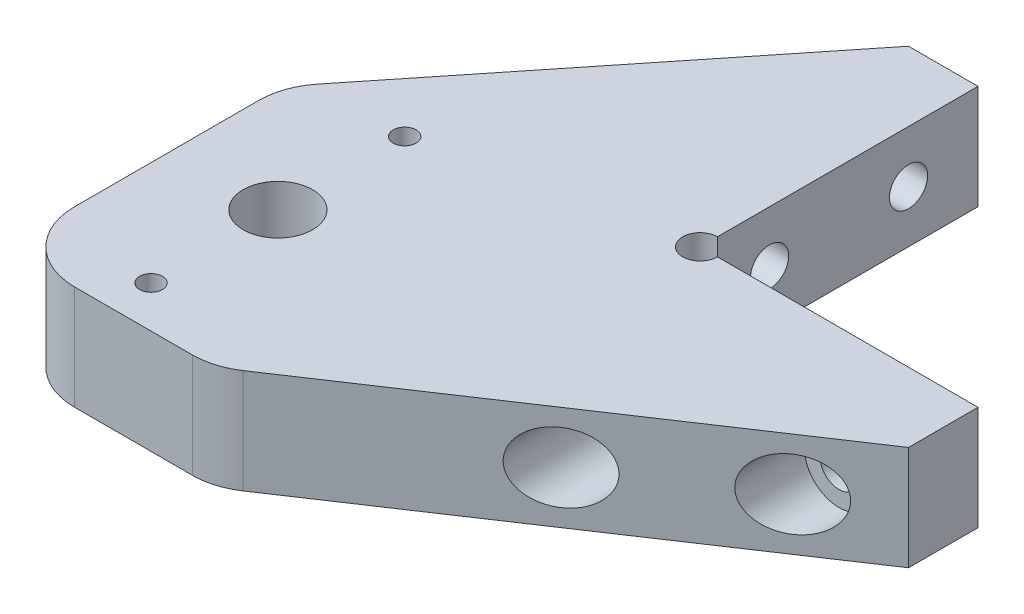
ISO-10303-21;
HEADER;
FILE_DESCRIPTION(('STEP AP214'),'2;1');
FILE_NAME('part.step','',(''),(''),'','','');
FILE_SCHEMA(('AUTOMOTIVE_DESIGN { 1 0 10303 214 1 1 1 1 }'));
ENDSEC;
DATA;
#1=APPLICATION_CONTEXT('core data for automotive mechanical design processes');
#2=APPLICATION_PROTOCOL_DEFINITION('international standard','automotive_design',2000,#1);
#3=PRODUCT_CONTEXT('',#1,'mechanical');
#4=PRODUCT('Part','Part','',(#3));
#5=PRODUCT_RELATED_PRODUCT_CATEGORY('part','',(#4));
#6=PRODUCT_DEFINITION_FORMATION('','',#4);
#7=PRODUCT_DEFINITION_CONTEXT('part definition',#1,'design');
#8=PRODUCT_DEFINITION('design','',#6,#7);
#9=PRODUCT_DEFINITION_SHAPE('','',#8);
#10=(LENGTH_UNIT() NAMED_UNIT(*) SI_UNIT(.MILLI.,.METRE.));
#11=(NAMED_UNIT(*) PLANE_ANGLE_UNIT() SI_UNIT($,.RADIAN.));
#12=(NAMED_UNIT(*) SI_UNIT($,.STERADIAN.) SOLID_ANGLE_UNIT());
#13=UNCERTAINTY_MEASURE_WITH_UNIT(LENGTH_MEASURE(1.E-05),#10,'distance_accuracy_value','');
#14=(GEOMETRIC_REPRESENTATION_CONTEXT(3) GLOBAL_UNCERTAINTY_ASSIGNED_CONTEXT((#13)) GLOBAL_UNIT_ASSIGNED_CONTEXT((#10,
#11,#12)) REPRESENTATION_CONTEXT('',''));
#15=CARTESIAN_POINT('',(0.,0.,0.));
#16=DIRECTION('',(0.,0.,1.));
#17=DIRECTION('',(1.,0.,0.));
#18=AXIS2_PLACEMENT_3D('',#15,#16,#17);
#19=CARTESIAN_POINT('',(0.,7.5,0.));
#20=DIRECTION('',(0.,-1.,0.));
#21=DIRECTION('',(0.,0.,-1.));
#22=AXIS2_PLACEMENT_3D('',#19,#20,#21);
#23=PLANE('',#22);
#24=CARTESIAN_POINT('',(-55.,7.5,64.));
#25=DIRECTION('',(0.,1.,0.));
#26=DIRECTION('',(0.,0.,1.));
#27=AXIS2_PLACEMENT_3D('',#24,#25,#26);
#28=CIRCLE('',#27,1.64999999999998);
#29=CARTESIAN_POINT('',(-55.,7.5,65.65));
#30=VERTEX_POINT('',#29);
#31=EDGE_CURVE('E261',#30,#30,#28,.T.);
#32=ORIENTED_EDGE('',*,*,#31,.F.);
#33=EDGE_LOOP('',(#32));
#34=FACE_BOUND('',#33,.T.);
#35=CARTESIAN_POINT('',(-55.,7.5,27.5));
#36=DIRECTION('',(0.,1.,0.));
#37=DIRECTION('',(0.,0.,1.));
#38=AXIS2_PLACEMENT_3D('',#35,#36,#37);
#39=CIRCLE('',#38,1.64999999999999);
#40=CARTESIAN_POINT('',(-55.,7.5,29.15));
#41=VERTEX_POINT('',#40);
#42=EDGE_CURVE('E253',#41,#41,#39,.T.);
#43=ORIENTED_EDGE('',*,*,#42,.F.);
#44=EDGE_LOOP('',(#43));
#45=FACE_BOUND('',#44,.T.);
#46=CARTESIAN_POINT('',(-55.,7.5,45.75));
#47=DIRECTION('',(0.,1.,0.));
#48=DIRECTION('',(0.,0.,1.));
#49=AXIS2_PLACEMENT_3D('',#46,#47,#48);
#50=CIRCLE('',#49,5.);
#51=CARTESIAN_POINT('',(-55.,7.5,50.75));
#52=VERTEX_POINT('',#51);
#53=EDGE_CURVE('E208',#52,#52,#50,.T.);
#54=ORIENTED_EDGE('',*,*,#53,.F.);
#55=EDGE_LOOP('',(#54));
#56=FACE_BOUND('',#55,.T.);
#57=CARTESIAN_POINT('',(-20.,7.5,20.));
#58=DIRECTION('',(0.,1.,0.));
#59=DIRECTION('',(0.,0.,1.));
#60=AXIS2_PLACEMENT_3D('',#57,#58,#59);
#61=CIRCLE('',#60,2.5);
#62=CARTESIAN_POINT('',(-20.,7.5,17.5));
#63=VERTEX_POINT('',#62);
#64=CARTESIAN_POINT('',(-17.5,7.5,20.));
#65=VERTEX_POINT('',#64);
#66=EDGE_CURVE('E148',#63,#65,#61,.T.);
#67=ORIENTED_EDGE('',*,*,#66,.F.);
#68=DIRECTION('',(0.,0.,-1.));
#69=VECTOR('',#68,1.);
#70=CARTESIAN_POINT('',(-20.,7.5,-20.));
#71=LINE('',#70,#69);
#72=CARTESIAN_POINT('',(-20.,7.5,-20.));
#73=VERTEX_POINT('',#72);
#74=EDGE_CURVE('E147',#63,#73,#71,.T.);
#75=ORIENTED_EDGE('',*,*,#74,.T.);
#76=DIRECTION('',(-1.,0.,0.));
#77=VECTOR('',#76,1.);
#78=CARTESIAN_POINT('',(-30.,7.5,-20.));
#79=LINE('',#78,#77);
#80=CARTESIAN_POINT('',(-30.,7.5,-20.));
#81=VERTEX_POINT('',#80);
#82=EDGE_CURVE('E155',#73,#81,#79,.T.);
#83=ORIENTED_EDGE('',*,*,#82,.T.);
#84=DIRECTION('',(-0.624695047554424,0.,0.78086880944303));
#85=VECTOR('',#84,1.);
#86=CARTESIAN_POINT('',(-30.,7.5,-20.));
#87=LINE('',#86,#85);
#88=CARTESIAN_POINT('',(-67.8086880944303,7.5,27.2608601180379));
#89=VERTEX_POINT('',#88);
#90=EDGE_CURVE('E159',#81,#89,#87,.T.);
#91=ORIENTED_EDGE('',*,*,#90,.T.);
#92=CARTESIAN_POINT('',(-60.,7.5,33.5078105935821));
#93=DIRECTION('',(0.,-1.,0.));
#94=DIRECTION('',(0.,0.,-1.));
#95=AXIS2_PLACEMENT_3D('',#92,#93,#94);
#96=CIRCLE('',#95,10.);
#97=CARTESIAN_POINT('',(-70.,7.5,33.5078105935821));
#98=VERTEX_POINT('',#97);
#99=EDGE_CURVE('E190',#89,#98,#96,.F.);
#100=ORIENTED_EDGE('',*,*,#99,.T.);
#101=DIRECTION('',(0.,0.,1.));
#102=VECTOR('',#101,1.);
#103=CARTESIAN_POINT('',(-70.,7.5,30.));
#104=LINE('',#103,#102);
#105=CARTESIAN_POINT('',(-70.,7.5,60.));
#106=VERTEX_POINT('',#105);
#107=EDGE_CURVE('E269',#98,#106,#104,.T.);
#108=ORIENTED_EDGE('',*,*,#107,.T.);
#109=CARTESIAN_POINT('',(-60.,7.5,60.));
#110=DIRECTION('',(0.,-1.,0.));
#111=DIRECTION('',(0.,0.,-1.));
#112=AXIS2_PLACEMENT_3D('',#109,#110,#111);
#113=CIRCLE('',#112,10.);
#114=CARTESIAN_POINT('',(-60.,7.5,70.));
#115=VERTEX_POINT('',#114);
#116=EDGE_CURVE('E192',#106,#115,#113,.F.);
#117=ORIENTED_EDGE('',*,*,#116,.T.);
#118=DIRECTION('',(1.,0.,0.));
#119=VECTOR('',#118,1.);
#120=CARTESIAN_POINT('',(-70.,7.5,70.));
#121=LINE('',#120,#119);
#122=CARTESIAN_POINT('',(-43.02775637732,7.5,70.));
#123=VERTEX_POINT('',#122);
#124=EDGE_CURVE('E271',#115,#123,#121,.T.);
#125=ORIENTED_EDGE('',*,*,#124,.T.);
#126=CARTESIAN_POINT('',(-43.02775637732,7.5,60.));
#127=DIRECTION('',(0.,-1.,0.));
#128=DIRECTION('',(0.,0.,-1.));
#129=AXIS2_PLACEMENT_3D('',#126,#127,#128);
#130=CIRCLE('',#129,10.);
#131=CARTESIAN_POINT('',(-37.4807544150677,7.5,68.3205029433784));
#132=VERTEX_POINT('',#131);
#133=EDGE_CURVE('E194',#123,#132,#130,.F.);
#134=ORIENTED_EDGE('',*,*,#133,.T.);
#135=DIRECTION('',(0.832050294337844,0.,-0.554700196225229));
#136=VECTOR('',#135,1.);
#137=CARTESIAN_POINT('',(-40.,7.5,70.));
#138=LINE('',#137,#136);
#139=CARTESIAN_POINT('',(20.,7.5,30.));
#140=VERTEX_POINT('',#139);
#141=EDGE_CURVE('E274',#132,#140,#138,.T.);
#142=ORIENTED_EDGE('',*,*,#141,.T.);
#143=DIRECTION('',(0.,0.,-1.));
#144=VECTOR('',#143,1.);
#145=CARTESIAN_POINT('',(20.,7.5,20.));
#146=LINE('',#145,#144);
#147=CARTESIAN_POINT('',(20.,7.5,20.));
#148=VERTEX_POINT('',#147);
#149=EDGE_CURVE('E276',#140,#148,#146,.T.);
#150=ORIENTED_EDGE('',*,*,#149,.T.);
#151=DIRECTION('',(-1.,0.,0.));
#152=VECTOR('',#151,1.);
#153=CARTESIAN_POINT('',(-20.,7.5,20.));
#154=LINE('',#153,#152);
#155=EDGE_CURVE('E278',#148,#65,#154,.T.);
#156=ORIENTED_EDGE('',*,*,#155,.T.);
#157=EDGE_LOOP('',(#67,#75,#83,#91,#100,#108,#117,#125,#134,#142,#150,#156));
#158=FACE_BOUND('',#157,.T.);
#159=ADVANCED_FACE('F46',(#34,#45,#56,#158),#23,.F.);
#160=CARTESIAN_POINT('',(-30.,7.5,-20.));
#161=DIRECTION('',(0.,0.,1.));
#162=DIRECTION('',(1.,0.,0.));
#163=AXIS2_PLACEMENT_3D('',#160,#161,#162);
#164=PLANE('',#163);
#165=DIRECTION('',(-1.,0.,0.));
#166=VECTOR('',#165,1.);
#167=CARTESIAN_POINT('',(-30.,-7.5,-20.));
#168=LINE('',#167,#166);
#169=CARTESIAN_POINT('',(-20.,-7.5,-20.));
#170=VERTEX_POINT('',#169);
#171=CARTESIAN_POINT('',(-30.,-7.5,-20.));
#172=VERTEX_POINT('',#171);
#173=EDGE_CURVE('E154',#170,#172,#168,.T.);
#174=ORIENTED_EDGE('',*,*,#173,.T.);
#175=DIRECTION('',(0.,-1.,0.));
#176=VECTOR('',#175,1.);
#177=CARTESIAN_POINT('',(-30.,7.5,-20.));
#178=LINE('',#177,#176);
#179=EDGE_CURVE('E173',#81,#172,#178,.T.);
#180=ORIENTED_EDGE('',*,*,#179,.F.);
#181=ORIENTED_EDGE('',*,*,#82,.F.);
#182=DIRECTION('',(0.,-1.,0.));
#183=VECTOR('',#182,1.);
#184=CARTESIAN_POINT('',(-20.,7.5,-20.));
#185=LINE('',#184,#183);
#186=EDGE_CURVE('E165',#73,#170,#185,.T.);
#187=ORIENTED_EDGE('',*,*,#186,.T.);
#188=EDGE_LOOP('',(#174,#180,#181,#187));
#189=FACE_BOUND('',#188,.T.);
#190=ADVANCED_FACE('F331',(#189),#164,.F.);
#191=CARTESIAN_POINT('',(-30.,7.5,-20.));
#192=DIRECTION('',(0.78086880944303,0.,0.624695047554424));
#193=DIRECTION('',(0.624695047554424,0.,-0.78086880944303));
#194=AXIS2_PLACEMENT_3D('',#191,#192,#193);
#195=PLANE('',#194);
#196=CARTESIAN_POINT('',(-54.,0.,10.));
#197=DIRECTION('',(0.78086880944303,0.,0.624695047554424));
#198=DIRECTION('',(-0.624695047554424,0.,0.78086880944303));
#199=AXIS2_PLACEMENT_3D('',#196,#197,#198);
#200=ELLIPSE('',#199,6.40312423743284,4.99999999999999);
#201=CARTESIAN_POINT('',(-58.,0.,15.));
#202=VERTEX_POINT('',#201);
#203=EDGE_CURVE('E225',#202,#202,#200,.T.);
#204=ORIENTED_EDGE('',*,*,#203,.T.);
#205=EDGE_LOOP('',(#204));
#206=FACE_BOUND('',#205,.T.);
#207=CARTESIAN_POINT('',(-38.,0.,-10.));
#208=DIRECTION('',(0.78086880944303,0.,0.624695047554424));
#209=DIRECTION('',(-0.624695047554424,0.,0.78086880944303));
#210=AXIS2_PLACEMENT_3D('',#207,#208,#209);
#211=ELLIPSE('',#210,6.40312423743284,4.99999999999999);
#212=CARTESIAN_POINT('',(-42.,0.,-5.));
#213=VERTEX_POINT('',#212);
#214=EDGE_CURVE('E217',#213,#213,#211,.T.);
#215=ORIENTED_EDGE('',*,*,#214,.T.);
#216=EDGE_LOOP('',(#215));
#217=FACE_BOUND('',#216,.T.);
#218=DIRECTION('',(-0.624695047554424,0.,0.78086880944303));
#219=VECTOR('',#218,1.);
#220=CARTESIAN_POINT('',(-30.,-7.5,-20.));
#221=LINE('',#220,#219);
#222=CARTESIAN_POINT('',(-67.8086880944303,-7.5,27.2608601180379));
#223=VERTEX_POINT('',#222);
#224=EDGE_CURVE('E283',#172,#223,#221,.T.);
#225=ORIENTED_EDGE('',*,*,#224,.T.);
#226=DIRECTION('',(0.,-1.,0.));
#227=VECTOR('',#226,1.);
#228=CARTESIAN_POINT('',(-67.8086880944303,7.5,27.2608601180379));
#229=LINE('',#228,#227);
#230=EDGE_CURVE('E54',#223,#89,#229,.F.);
#231=ORIENTED_EDGE('',*,*,#230,.T.);
#232=ORIENTED_EDGE('',*,*,#90,.F.);
#233=ORIENTED_EDGE('',*,*,#179,.T.);
#234=EDGE_LOOP('',(#225,#231,#232,#233));
#235=FACE_BOUND('',#234,.T.);
#236=ADVANCED_FACE('F339',(#206,#217,#235),#195,.F.);
#237=CARTESIAN_POINT('',(-70.,7.5,30.));
#238=DIRECTION('',(1.,0.,0.));
#239=DIRECTION('',(0.,0.,-1.));
#240=AXIS2_PLACEMENT_3D('',#237,#238,#239);
#241=PLANE('',#240);
#242=DIRECTION('',(0.,0.,1.));
#243=VECTOR('',#242,1.);
#244=CARTESIAN_POINT('',(-70.,-7.5,30.));
#245=LINE('',#244,#243);
#246=CARTESIAN_POINT('',(-70.,-7.5,33.5078105935821));
#247=VERTEX_POINT('',#246);
#248=CARTESIAN_POINT('',(-70.,-7.5,60.));
#249=VERTEX_POINT('',#248);
#250=EDGE_CURVE('E286',#247,#249,#245,.T.);
#251=ORIENTED_EDGE('',*,*,#250,.T.);
#252=DIRECTION('',(0.,-1.,0.));
#253=VECTOR('',#252,1.);
#254=CARTESIAN_POINT('',(-70.,7.5,60.));
#255=LINE('',#254,#253);
#256=EDGE_CURVE('E68',#249,#106,#255,.F.);
#257=ORIENTED_EDGE('',*,*,#256,.T.);
#258=ORIENTED_EDGE('',*,*,#107,.F.);
#259=DIRECTION('',(0.,-1.,0.));
#260=VECTOR('',#259,1.);
#261=CARTESIAN_POINT('',(-70.,7.5,33.5078105935821));
#262=LINE('',#261,#260);
#263=EDGE_CURVE('E196',#98,#247,#262,.T.);
#264=ORIENTED_EDGE('',*,*,#263,.T.);
#265=EDGE_LOOP('',(#251,#257,#258,#264));
#266=FACE_BOUND('',#265,.T.);
#267=ADVANCED_FACE('F359',(#266),#241,.F.);
#268=CARTESIAN_POINT('',(-70.,7.5,70.));
#269=DIRECTION('',(0.,0.,-1.));
#270=DIRECTION('',(-1.,0.,0.));
#271=AXIS2_PLACEMENT_3D('',#268,#269,#270);
#272=PLANE('',#271);
#273=DIRECTION('',(1.,0.,0.));
#274=VECTOR('',#273,1.);
#275=CARTESIAN_POINT('',(-70.,-7.5,70.));
#276=LINE('',#275,#274);
#277=CARTESIAN_POINT('',(-60.,-7.5,70.));
#278=VERTEX_POINT('',#277);
#279=CARTESIAN_POINT('',(-43.02775637732,-7.5,70.));
#280=VERTEX_POINT('',#279);
#281=EDGE_CURVE('E288',#278,#280,#276,.T.);
#282=ORIENTED_EDGE('',*,*,#281,.T.);
#283=DIRECTION('',(0.,-1.,0.));
#284=VECTOR('',#283,1.);
#285=CARTESIAN_POINT('',(-43.02775637732,7.5,70.));
#286=LINE('',#285,#284);
#287=EDGE_CURVE('E188',#280,#123,#286,.F.);
#288=ORIENTED_EDGE('',*,*,#287,.T.);
#289=ORIENTED_EDGE('',*,*,#124,.F.);
#290=DIRECTION('',(0.,-1.,0.));
#291=VECTOR('',#290,1.);
#292=CARTESIAN_POINT('',(-60.,7.5,70.));
#293=LINE('',#292,#291);
#294=EDGE_CURVE('E185',#115,#278,#293,.T.);
#295=ORIENTED_EDGE('',*,*,#294,.T.);
#296=EDGE_LOOP('',(#282,#288,#289,#295));
#297=FACE_BOUND('',#296,.T.);
#298=ADVANCED_FACE('F312',(#297),#272,.F.);
#299=CARTESIAN_POINT('',(-40.,7.5,70.));
#300=DIRECTION('',(-0.554700196225229,0.,-0.832050294337844));
#301=DIRECTION('',(-0.832050294337844,0.,0.554700196225229));
#302=AXIS2_PLACEMENT_3D('',#299,#300,#301);
#303=PLANE('',#302);
#304=CARTESIAN_POINT('',(10.,0.,36.6666666666667));
#305=DIRECTION('',(-0.554700196225229,0.,-0.832050294337844));
#306=DIRECTION('',(-0.832050294337844,0.,0.554700196225229));
#307=AXIS2_PLACEMENT_3D('',#304,#305,#306);
#308=ELLIPSE('',#307,6.00925212577331,4.99999999999999);
#309=CARTESIAN_POINT('',(5.00000000000001,0.,40.));
#310=VERTEX_POINT('',#309);
#311=EDGE_CURVE('E209',#310,#310,#308,.T.);
#312=ORIENTED_EDGE('',*,*,#311,.T.);
#313=EDGE_LOOP('',(#312));
#314=FACE_BOUND('',#313,.T.);
#315=CARTESIAN_POINT('',(-10.,0.,50.));
#316=DIRECTION('',(-0.554700196225229,0.,-0.832050294337844));
#317=DIRECTION('',(-0.832050294337844,0.,0.554700196225229));
#318=AXIS2_PLACEMENT_3D('',#315,#316,#317);
#319=ELLIPSE('',#318,6.00925212577331,4.99999999999999);
#320=CARTESIAN_POINT('',(-15.,0.,53.3333333333333));
#321=VERTEX_POINT('',#320);
#322=EDGE_CURVE('E201',#321,#321,#319,.T.);
#323=ORIENTED_EDGE('',*,*,#322,.T.);
#324=EDGE_LOOP('',(#323));
#325=FACE_BOUND('',#324,.T.);
#326=ORIENTED_EDGE('',*,*,#141,.F.);
#327=DIRECTION('',(0.,-1.,0.));
#328=VECTOR('',#327,1.);
#329=CARTESIAN_POINT('',(-37.4807544150677,7.5,68.3205029433784));
#330=LINE('',#329,#328);
#331=CARTESIAN_POINT('',(-37.4807544150677,-7.5,68.3205029433784));
#332=VERTEX_POINT('',#331);
#333=EDGE_CURVE('E176',#132,#332,#330,.T.);
#334=ORIENTED_EDGE('',*,*,#333,.T.);
#335=DIRECTION('',(0.832050294337844,0.,-0.554700196225229));
#336=VECTOR('',#335,1.);
#337=CARTESIAN_POINT('',(-40.,-7.5,70.));
#338=LINE('',#337,#336);
#339=CARTESIAN_POINT('',(20.,-7.5,30.));
#340=VERTEX_POINT('',#339);
#341=EDGE_CURVE('E291',#332,#340,#338,.T.);
#342=ORIENTED_EDGE('',*,*,#341,.T.);
#343=DIRECTION('',(0.,-1.,0.));
#344=VECTOR('',#343,1.);
#345=CARTESIAN_POINT('',(20.,7.5,30.));
#346=LINE('',#345,#344);
#347=EDGE_CURVE('E170',#140,#340,#346,.T.);
#348=ORIENTED_EDGE('',*,*,#347,.F.);
#349=EDGE_LOOP('',(#326,#334,#342,#348));
#350=FACE_BOUND('',#349,.T.);
#351=ADVANCED_FACE('F307',(#314,#325,#350),#303,.F.);
#352=CARTESIAN_POINT('',(20.,7.5,20.));
#353=DIRECTION('',(-1.,0.,0.));
#354=DIRECTION('',(0.,0.,1.));
#355=AXIS2_PLACEMENT_3D('',#352,#353,#354);
#356=PLANE('',#355);
#357=DIRECTION('',(0.,0.,-1.));
#358=VECTOR('',#357,1.);
#359=CARTESIAN_POINT('',(20.,-7.5,20.));
#360=LINE('',#359,#358);
#361=CARTESIAN_POINT('',(20.,-7.5,20.));
#362=VERTEX_POINT('',#361);
#363=EDGE_CURVE('E161',#340,#362,#360,.T.);
#364=ORIENTED_EDGE('',*,*,#363,.T.);
#365=DIRECTION('',(0.,-1.,0.));
#366=VECTOR('',#365,1.);
#367=CARTESIAN_POINT('',(20.,7.5,20.));
#368=LINE('',#367,#366);
#369=EDGE_CURVE('E167',#148,#362,#368,.T.);
#370=ORIENTED_EDGE('',*,*,#369,.F.);
#371=ORIENTED_EDGE('',*,*,#149,.F.);
#372=ORIENTED_EDGE('',*,*,#347,.T.);
#373=EDGE_LOOP('',(#364,#370,#371,#372));
#374=FACE_BOUND('',#373,.T.);
#375=ADVANCED_FACE('F295',(#374),#356,.F.);
#376=CARTESIAN_POINT('',(-20.,7.5,20.));
#377=DIRECTION('',(0.,0.,1.));
#378=DIRECTION('',(1.,0.,0.));
#379=AXIS2_PLACEMENT_3D('',#376,#377,#378);
#380=PLANE('',#379);
#381=CARTESIAN_POINT('',(10.,0.,20.));
#382=DIRECTION('',(0.,0.,1.));
#383=DIRECTION('',(1.,0.,0.));
#384=AXIS2_PLACEMENT_3D('',#381,#382,#383);
#385=CIRCLE('',#384,2.74999999999998);
#386=CARTESIAN_POINT('',(12.75,0.,20.));
#387=VERTEX_POINT('',#386);
#388=EDGE_CURVE('E212',#387,#387,#385,.T.);
#389=ORIENTED_EDGE('',*,*,#388,.T.);
#390=EDGE_LOOP('',(#389));
#391=FACE_BOUND('',#390,.T.);
#392=CARTESIAN_POINT('',(-10.,0.,20.));
#393=DIRECTION('',(0.,0.,1.));
#394=DIRECTION('',(1.,0.,0.));
#395=AXIS2_PLACEMENT_3D('',#392,#393,#394);
#396=CIRCLE('',#395,2.74999999999998);
#397=CARTESIAN_POINT('',(-7.25000000000002,0.,20.));
#398=VERTEX_POINT('',#397);
#399=EDGE_CURVE('E204',#398,#398,#396,.T.);
#400=ORIENTED_EDGE('',*,*,#399,.T.);
#401=EDGE_LOOP('',(#400));
#402=FACE_BOUND('',#401,.T.);
#403=DIRECTION('',(-1.,0.,0.));
#404=VECTOR('',#403,1.);
#405=CARTESIAN_POINT('',(-20.,-7.5,20.));
#406=LINE('',#405,#404);
#407=CARTESIAN_POINT('',(-17.5,-7.5,20.));
#408=VERTEX_POINT('',#407);
#409=EDGE_CURVE('E156',#362,#408,#406,.T.);
#410=ORIENTED_EDGE('',*,*,#409,.T.);
#411=DIRECTION('',(0.,1.,0.));
#412=VECTOR('',#411,1.);
#413=CARTESIAN_POINT('',(-17.5,7.5,20.));
#414=LINE('',#413,#412);
#415=EDGE_CURVE('E60',#408,#65,#414,.T.);
#416=ORIENTED_EDGE('',*,*,#415,.T.);
#417=ORIENTED_EDGE('',*,*,#155,.F.);
#418=ORIENTED_EDGE('',*,*,#369,.T.);
#419=EDGE_LOOP('',(#410,#416,#417,#418));
#420=FACE_BOUND('',#419,.T.);
#421=ADVANCED_FACE('F301',(#391,#402,#420),#380,.F.);
#422=CARTESIAN_POINT('',(-20.,7.5,-20.));
#423=DIRECTION('',(-1.,0.,0.));
#424=DIRECTION('',(0.,0.,1.));
#425=AXIS2_PLACEMENT_3D('',#422,#423,#424);
#426=PLANE('',#425);
#427=CARTESIAN_POINT('',(-20.,0.,10.));
#428=DIRECTION('',(-1.,0.,0.));
#429=DIRECTION('',(0.,0.,1.));
#430=AXIS2_PLACEMENT_3D('',#427,#428,#429);
#431=CIRCLE('',#430,2.74999999999998);
#432=CARTESIAN_POINT('',(-20.,0.,12.75));
#433=VERTEX_POINT('',#432);
#434=EDGE_CURVE('E227',#433,#433,#431,.T.);
#435=ORIENTED_EDGE('',*,*,#434,.T.);
#436=EDGE_LOOP('',(#435));
#437=FACE_BOUND('',#436,.T.);
#438=CARTESIAN_POINT('',(-20.,0.,-10.));
#439=DIRECTION('',(-1.,0.,0.));
#440=DIRECTION('',(0.,0.,1.));
#441=AXIS2_PLACEMENT_3D('',#438,#439,#440);
#442=CIRCLE('',#441,2.74999999999998);
#443=CARTESIAN_POINT('',(-20.,0.,-7.25000000000002));
#444=VERTEX_POINT('',#443);
#445=EDGE_CURVE('E220',#444,#444,#442,.T.);
#446=ORIENTED_EDGE('',*,*,#445,.T.);
#447=EDGE_LOOP('',(#446));
#448=FACE_BOUND('',#447,.T.);
#449=ORIENTED_EDGE('',*,*,#74,.F.);
#450=DIRECTION('',(0.,1.,0.));
#451=VECTOR('',#450,1.);
#452=CARTESIAN_POINT('',(-20.,7.5,17.5));
#453=LINE('',#452,#451);
#454=CARTESIAN_POINT('',(-20.,-7.5,17.5));
#455=VERTEX_POINT('',#454);
#456=EDGE_CURVE('E135',#63,#455,#453,.F.);
#457=ORIENTED_EDGE('',*,*,#456,.T.);
#458=DIRECTION('',(0.,0.,-1.));
#459=VECTOR('',#458,1.);
#460=CARTESIAN_POINT('',(-20.,-7.5,-20.));
#461=LINE('',#460,#459);
#462=EDGE_CURVE('E145',#455,#170,#461,.T.);
#463=ORIENTED_EDGE('',*,*,#462,.T.);
#464=ORIENTED_EDGE('',*,*,#186,.F.);
#465=EDGE_LOOP('',(#449,#457,#463,#464));
#466=FACE_BOUND('',#465,.T.);
#467=ADVANCED_FACE('F143',(#437,#448,#466),#426,.F.);
#468=CARTESIAN_POINT('',(0.,-7.5,0.));
#469=DIRECTION('',(0.,-1.,0.));
#470=DIRECTION('',(0.,0.,-1.));
#471=AXIS2_PLACEMENT_3D('',#468,#469,#470);
#472=PLANE('',#471);
#473=CARTESIAN_POINT('',(-20.,-7.5,20.));
#474=DIRECTION('',(0.,-1.,0.));
#475=DIRECTION('',(0.,0.,-1.));
#476=AXIS2_PLACEMENT_3D('',#473,#474,#475);
#477=CIRCLE('',#476,2.5);
#478=EDGE_CURVE('E11',#408,#455,#477,.T.);
#479=ORIENTED_EDGE('',*,*,#478,.F.);
#480=ORIENTED_EDGE('',*,*,#409,.F.);
#481=ORIENTED_EDGE('',*,*,#363,.F.);
#482=ORIENTED_EDGE('',*,*,#341,.F.);
#483=CARTESIAN_POINT('',(-43.02775637732,-7.5,60.));
#484=DIRECTION('',(0.,-1.,0.));
#485=DIRECTION('',(0.,0.,-1.));
#486=AXIS2_PLACEMENT_3D('',#483,#484,#485);
#487=CIRCLE('',#486,10.);
#488=EDGE_CURVE('E183',#332,#280,#487,.T.);
#489=ORIENTED_EDGE('',*,*,#488,.T.);
#490=ORIENTED_EDGE('',*,*,#281,.F.);
#491=CARTESIAN_POINT('',(-60.,-7.5,60.));
#492=DIRECTION('',(0.,-1.,0.));
#493=DIRECTION('',(0.,0.,-1.));
#494=AXIS2_PLACEMENT_3D('',#491,#492,#493);
#495=CIRCLE('',#494,10.);
#496=EDGE_CURVE('E181',#278,#249,#495,.T.);
#497=ORIENTED_EDGE('',*,*,#496,.T.);
#498=ORIENTED_EDGE('',*,*,#250,.F.);
#499=CARTESIAN_POINT('',(-60.,-7.5,33.5078105935821));
#500=DIRECTION('',(0.,-1.,0.));
#501=DIRECTION('',(0.,0.,-1.));
#502=AXIS2_PLACEMENT_3D('',#499,#500,#501);
#503=CIRCLE('',#502,10.);
#504=EDGE_CURVE('E179',#247,#223,#503,.T.);
#505=ORIENTED_EDGE('',*,*,#504,.T.);
#506=ORIENTED_EDGE('',*,*,#224,.F.);
#507=ORIENTED_EDGE('',*,*,#173,.F.);
#508=ORIENTED_EDGE('',*,*,#462,.F.);
#509=EDGE_LOOP('',(#479,#480,#481,#482,#489,#490,#497,#498,#505,#506,#507,#508));
#510=FACE_BOUND('',#509,.T.);
#511=CARTESIAN_POINT('',(-55.,-7.5,45.75));
#512=DIRECTION('',(0.,1.,0.));
#513=DIRECTION('',(0.,0.,1.));
#514=AXIS2_PLACEMENT_3D('',#511,#512,#513);
#515=CIRCLE('',#514,5.);
#516=CARTESIAN_POINT('',(-55.,-7.5,50.75));
#517=VERTEX_POINT('',#516);
#518=EDGE_CURVE('E250',#517,#517,#515,.T.);
#519=ORIENTED_EDGE('',*,*,#518,.T.);
#520=EDGE_LOOP('',(#519));
#521=FACE_BOUND('',#520,.T.);
#522=CARTESIAN_POINT('',(-55.,-7.5,27.5));
#523=DIRECTION('',(0.,1.,0.));
#524=DIRECTION('',(0.,0.,1.));
#525=AXIS2_PLACEMENT_3D('',#522,#523,#524);
#526=CIRCLE('',#525,1.65);
#527=CARTESIAN_POINT('',(-55.,-7.5,29.15));
#528=VERTEX_POINT('',#527);
#529=EDGE_CURVE('E258',#528,#528,#526,.T.);
#530=ORIENTED_EDGE('',*,*,#529,.T.);
#531=EDGE_LOOP('',(#530));
#532=FACE_BOUND('',#531,.T.);
#533=CARTESIAN_POINT('',(-55.,-7.5,64.));
#534=DIRECTION('',(0.,1.,0.));
#535=DIRECTION('',(0.,0.,1.));
#536=AXIS2_PLACEMENT_3D('',#533,#534,#535);
#537=CIRCLE('',#536,1.65);
#538=CARTESIAN_POINT('',(-55.,-7.5,65.65));
#539=VERTEX_POINT('',#538);
#540=EDGE_CURVE('E264',#539,#539,#537,.T.);
#541=ORIENTED_EDGE('',*,*,#540,.T.);
#542=EDGE_LOOP('',(#541));
#543=FACE_BOUND('',#542,.T.);
#544=ADVANCED_FACE('F151',(#510,#521,#532,#543),#472,.T.);
#545=CARTESIAN_POINT('',(-55.,7.5,64.));
#546=DIRECTION('',(0.,1.,0.));
#547=DIRECTION('',(0.,0.,1.));
#548=AXIS2_PLACEMENT_3D('',#545,#546,#547);
#549=CYLINDRICAL_SURFACE('',#548,1.64999999999999);
#550=ORIENTED_EDGE('',*,*,#540,.F.);
#551=EDGE_LOOP('',(#550));
#552=FACE_BOUND('',#551,.T.);
#553=ORIENTED_EDGE('',*,*,#31,.T.);
#554=EDGE_LOOP('',(#553));
#555=FACE_BOUND('',#554,.T.);
#556=ADVANCED_FACE('F345',(#552,#555),#549,.F.);
#557=CARTESIAN_POINT('',(-55.,7.5,27.5));
#558=DIRECTION('',(0.,1.,0.));
#559=DIRECTION('',(0.,0.,1.));
#560=AXIS2_PLACEMENT_3D('',#557,#558,#559);
#561=CYLINDRICAL_SURFACE('',#560,1.65);
#562=ORIENTED_EDGE('',*,*,#529,.F.);
#563=EDGE_LOOP('',(#562));
#564=FACE_BOUND('',#563,.T.);
#565=ORIENTED_EDGE('',*,*,#42,.T.);
#566=EDGE_LOOP('',(#565));
#567=FACE_BOUND('',#566,.T.);
#568=ADVANCED_FACE('F326',(#564,#567),#561,.F.);
#569=CARTESIAN_POINT('',(-55.,-7.5,45.75));
#570=DIRECTION('',(0.,1.,0.));
#571=DIRECTION('',(0.,0.,1.));
#572=AXIS2_PLACEMENT_3D('',#569,#570,#571);
#573=CYLINDRICAL_SURFACE('',#572,5.);
#574=ORIENTED_EDGE('',*,*,#518,.F.);
#575=EDGE_LOOP('',(#574));
#576=FACE_BOUND('',#575,.T.);
#577=ORIENTED_EDGE('',*,*,#53,.T.);
#578=EDGE_LOOP('',(#577));
#579=FACE_BOUND('',#578,.T.);
#580=ADVANCED_FACE('F318',(#576,#579),#573,.F.);
#581=CARTESIAN_POINT('',(-43.02775637732,7.5,60.));
#582=DIRECTION('',(0.,-1.,0.));
#583=DIRECTION('',(0.,0.,-1.));
#584=AXIS2_PLACEMENT_3D('',#581,#582,#583);
#585=CYLINDRICAL_SURFACE('',#584,10.);
#586=ORIENTED_EDGE('',*,*,#133,.F.);
#587=ORIENTED_EDGE('',*,*,#287,.F.);
#588=ORIENTED_EDGE('',*,*,#488,.F.);
#589=ORIENTED_EDGE('',*,*,#333,.F.);
#590=EDGE_LOOP('',(#586,#587,#588,#589));
#591=FACE_BOUND('',#590,.T.);
#592=ADVANCED_FACE('F315',(#591),#585,.T.);
#593=CARTESIAN_POINT('',(-60.,7.5,60.));
#594=DIRECTION('',(0.,-1.,0.));
#595=DIRECTION('',(0.,0.,-1.));
#596=AXIS2_PLACEMENT_3D('',#593,#594,#595);
#597=CYLINDRICAL_SURFACE('',#596,10.);
#598=ORIENTED_EDGE('',*,*,#116,.F.);
#599=ORIENTED_EDGE('',*,*,#256,.F.);
#600=ORIENTED_EDGE('',*,*,#496,.F.);
#601=ORIENTED_EDGE('',*,*,#294,.F.);
#602=EDGE_LOOP('',(#598,#599,#600,#601));
#603=FACE_BOUND('',#602,.T.);
#604=ADVANCED_FACE('F317',(#603),#597,.T.);
#605=CARTESIAN_POINT('',(-60.,7.5,33.5078105935821));
#606=DIRECTION('',(0.,-1.,0.));
#607=DIRECTION('',(0.,0.,-1.));
#608=AXIS2_PLACEMENT_3D('',#605,#606,#607);
#609=CYLINDRICAL_SURFACE('',#608,10.);
#610=ORIENTED_EDGE('',*,*,#99,.F.);
#611=ORIENTED_EDGE('',*,*,#230,.F.);
#612=ORIENTED_EDGE('',*,*,#504,.F.);
#613=ORIENTED_EDGE('',*,*,#263,.F.);
#614=EDGE_LOOP('',(#610,#611,#612,#613));
#615=FACE_BOUND('',#614,.T.);
#616=ADVANCED_FACE('F48',(#615),#609,.T.);
#617=CARTESIAN_POINT('',(-10.,0.,70.));
#618=DIRECTION('',(0.,0.,1.));
#619=DIRECTION('',(1.,0.,0.));
#620=AXIS2_PLACEMENT_3D('',#617,#618,#619);
#621=CYLINDRICAL_SURFACE('',#620,2.74999999999998);
#622=CARTESIAN_POINT('',(-10.,0.,30.));
#623=DIRECTION('',(0.,0.,1.));
#624=DIRECTION('',(1.,0.,0.));
#625=AXIS2_PLACEMENT_3D('',#622,#623,#624);
#626=CIRCLE('',#625,2.75);
#627=CARTESIAN_POINT('',(-7.25,0.,30.));
#628=VERTEX_POINT('',#627);
#629=EDGE_CURVE('E205',#628,#628,#626,.T.);
#630=ORIENTED_EDGE('',*,*,#629,.T.);
#631=EDGE_LOOP('',(#630));
#632=FACE_BOUND('',#631,.T.);
#633=ORIENTED_EDGE('',*,*,#399,.F.);
#634=EDGE_LOOP('',(#633));
#635=FACE_BOUND('',#634,.T.);
#636=ADVANCED_FACE('F381',(#632,#635),#621,.F.);
#637=CARTESIAN_POINT('',(-10.,0.,70.));
#638=DIRECTION('',(0.,0.,1.));
#639=DIRECTION('',(1.,0.,0.));
#640=AXIS2_PLACEMENT_3D('',#637,#638,#639);
#641=CYLINDRICAL_SURFACE('',#640,4.99999999999999);
#642=CARTESIAN_POINT('',(-10.,0.,30.));
#643=DIRECTION('',(0.,0.,1.));
#644=DIRECTION('',(1.,0.,0.));
#645=AXIS2_PLACEMENT_3D('',#642,#643,#644);
#646=CIRCLE('',#645,4.99999999999999);
#647=CARTESIAN_POINT('',(-5.00000000000001,0.,30.));
#648=VERTEX_POINT('',#647);
#649=EDGE_CURVE('E216',#648,#648,#646,.T.);
#650=ORIENTED_EDGE('',*,*,#649,.F.);
#651=EDGE_LOOP('',(#650));
#652=FACE_BOUND('',#651,.T.);
#653=ORIENTED_EDGE('',*,*,#322,.F.);
#654=EDGE_LOOP('',(#653));
#655=FACE_BOUND('',#654,.T.);
#656=ADVANCED_FACE('F385',(#652,#655),#641,.F.);
#657=CARTESIAN_POINT('',(-7.25,0.,30.));
#658=DIRECTION('',(0.,0.,-1.));
#659=DIRECTION('',(-1.,0.,0.));
#660=AXIS2_PLACEMENT_3D('',#657,#658,#659);
#661=PLANE('',#660);
#662=ORIENTED_EDGE('',*,*,#629,.F.);
#663=EDGE_LOOP('',(#662));
#664=FACE_BOUND('',#663,.T.);
#665=ORIENTED_EDGE('',*,*,#649,.T.);
#666=EDGE_LOOP('',(#665));
#667=FACE_BOUND('',#666,.T.);
#668=ADVANCED_FACE('F391',(#664,#667),#661,.F.);
#669=CARTESIAN_POINT('',(10.,0.,70.));
#670=DIRECTION('',(0.,0.,1.));
#671=DIRECTION('',(1.,0.,0.));
#672=AXIS2_PLACEMENT_3D('',#669,#670,#671);
#673=CYLINDRICAL_SURFACE('',#672,2.74999999999998);
#674=CARTESIAN_POINT('',(10.,0.,30.));
#675=DIRECTION('',(0.,0.,1.));
#676=DIRECTION('',(1.,0.,0.));
#677=AXIS2_PLACEMENT_3D('',#674,#675,#676);
#678=CIRCLE('',#677,2.75);
#679=CARTESIAN_POINT('',(12.75,0.,30.));
#680=VERTEX_POINT('',#679);
#681=EDGE_CURVE('E213',#680,#680,#678,.T.);
#682=ORIENTED_EDGE('',*,*,#681,.T.);
#683=EDGE_LOOP('',(#682));
#684=FACE_BOUND('',#683,.T.);
#685=ORIENTED_EDGE('',*,*,#388,.F.);
#686=EDGE_LOOP('',(#685));
#687=FACE_BOUND('',#686,.T.);
#688=ADVANCED_FACE('F547',(#684,#687),#673,.F.);
#689=CARTESIAN_POINT('',(10.,0.,70.));
#690=DIRECTION('',(0.,0.,1.));
#691=DIRECTION('',(1.,0.,0.));
#692=AXIS2_PLACEMENT_3D('',#689,#690,#691);
#693=CYLINDRICAL_SURFACE('',#692,4.99999999999999);
#694=CARTESIAN_POINT('',(10.,0.,30.));
#695=DIRECTION('',(0.,0.,1.));
#696=DIRECTION('',(1.,0.,0.));
#697=AXIS2_PLACEMENT_3D('',#694,#695,#696);
#698=CIRCLE('',#697,4.99999999999999);
#699=CARTESIAN_POINT('',(15.,0.,30.));
#700=VERTEX_POINT('',#699);
#701=EDGE_CURVE('E224',#700,#700,#698,.T.);
#702=ORIENTED_EDGE('',*,*,#701,.F.);
#703=EDGE_LOOP('',(#702));
#704=FACE_BOUND('',#703,.T.);
#705=ORIENTED_EDGE('',*,*,#311,.F.);
#706=EDGE_LOOP('',(#705));
#707=FACE_BOUND('',#706,.T.);
#708=ADVANCED_FACE('F555',(#704,#707),#693,.F.);
#709=CARTESIAN_POINT('',(12.75,0.,30.));
#710=DIRECTION('',(0.,0.,-1.));
#711=DIRECTION('',(-1.,0.,0.));
#712=AXIS2_PLACEMENT_3D('',#709,#710,#711);
#713=PLANE('',#712);
#714=ORIENTED_EDGE('',*,*,#681,.F.);
#715=EDGE_LOOP('',(#714));
#716=FACE_BOUND('',#715,.T.);
#717=ORIENTED_EDGE('',*,*,#701,.T.);
#718=EDGE_LOOP('',(#717));
#719=FACE_BOUND('',#718,.T.);
#720=ADVANCED_FACE('F564',(#716,#719),#713,.F.);
#721=CARTESIAN_POINT('',(-70.,0.,-10.));
#722=DIRECTION('',(-1.,0.,0.));
#723=DIRECTION('',(0.,0.,1.));
#724=AXIS2_PLACEMENT_3D('',#721,#722,#723);
#725=CYLINDRICAL_SURFACE('',#724,2.74999999999998);
#726=CARTESIAN_POINT('',(-30.,0.,-10.));
#727=DIRECTION('',(-1.,0.,0.));
#728=DIRECTION('',(0.,0.,1.));
#729=AXIS2_PLACEMENT_3D('',#726,#727,#728);
#730=CIRCLE('',#729,2.75);
#731=CARTESIAN_POINT('',(-30.,0.,-7.25));
#732=VERTEX_POINT('',#731);
#733=EDGE_CURVE('E221',#732,#732,#730,.T.);
#734=ORIENTED_EDGE('',*,*,#733,.T.);
#735=EDGE_LOOP('',(#734));
#736=FACE_BOUND('',#735,.T.);
#737=ORIENTED_EDGE('',*,*,#445,.F.);
#738=EDGE_LOOP('',(#737));
#739=FACE_BOUND('',#738,.T.);
#740=ADVANCED_FACE('F572',(#736,#739),#725,.F.);
#741=CARTESIAN_POINT('',(-70.,0.,-10.));
#742=DIRECTION('',(-1.,0.,0.));
#743=DIRECTION('',(0.,0.,1.));
#744=AXIS2_PLACEMENT_3D('',#741,#742,#743);
#745=CYLINDRICAL_SURFACE('',#744,4.99999999999999);
#746=CARTESIAN_POINT('',(-30.,0.,-10.));
#747=DIRECTION('',(-1.,0.,0.));
#748=DIRECTION('',(0.,0.,1.));
#749=AXIS2_PLACEMENT_3D('',#746,#747,#748);
#750=CIRCLE('',#749,4.99999999999999);
#751=CARTESIAN_POINT('',(-30.,0.,-5.));
#752=VERTEX_POINT('',#751);
#753=EDGE_CURVE('E230',#752,#752,#750,.T.);
#754=ORIENTED_EDGE('',*,*,#753,.F.);
#755=EDGE_LOOP('',(#754));
#756=FACE_BOUND('',#755,.T.);
#757=ORIENTED_EDGE('',*,*,#214,.F.);
#758=EDGE_LOOP('',(#757));
#759=FACE_BOUND('',#758,.T.);
#760=ADVANCED_FACE('F580',(#756,#759),#745,.F.);
#761=CARTESIAN_POINT('',(-30.,2.75,-10.));
#762=DIRECTION('',(1.,0.,0.));
#763=DIRECTION('',(0.,0.,-1.));
#764=AXIS2_PLACEMENT_3D('',#761,#762,#763);
#765=PLANE('',#764);
#766=ORIENTED_EDGE('',*,*,#733,.F.);
#767=EDGE_LOOP('',(#766));
#768=FACE_BOUND('',#767,.T.);
#769=ORIENTED_EDGE('',*,*,#753,.T.);
#770=EDGE_LOOP('',(#769));
#771=FACE_BOUND('',#770,.T.);
#772=ADVANCED_FACE('F589',(#768,#771),#765,.F.);
#773=CARTESIAN_POINT('',(-70.,0.,10.));
#774=DIRECTION('',(-1.,0.,0.));
#775=DIRECTION('',(0.,0.,1.));
#776=AXIS2_PLACEMENT_3D('',#773,#774,#775);
#777=CYLINDRICAL_SURFACE('',#776,2.74999999999998);
#778=CARTESIAN_POINT('',(-30.,0.,10.));
#779=DIRECTION('',(-1.,0.,0.));
#780=DIRECTION('',(0.,0.,1.));
#781=AXIS2_PLACEMENT_3D('',#778,#779,#780);
#782=CIRCLE('',#781,2.75);
#783=CARTESIAN_POINT('',(-30.,0.,12.75));
#784=VERTEX_POINT('',#783);
#785=EDGE_CURVE('E228',#784,#784,#782,.T.);
#786=ORIENTED_EDGE('',*,*,#785,.T.);
#787=EDGE_LOOP('',(#786));
#788=FACE_BOUND('',#787,.T.);
#789=ORIENTED_EDGE('',*,*,#434,.F.);
#790=EDGE_LOOP('',(#789));
#791=FACE_BOUND('',#790,.T.);
#792=ADVANCED_FACE('F598',(#788,#791),#777,.F.);
#793=CARTESIAN_POINT('',(-70.,0.,10.));
#794=DIRECTION('',(-1.,0.,0.));
#795=DIRECTION('',(0.,0.,1.));
#796=AXIS2_PLACEMENT_3D('',#793,#794,#795);
#797=CYLINDRICAL_SURFACE('',#796,4.99999999999999);
#798=CARTESIAN_POINT('',(-30.,0.,10.));
#799=DIRECTION('',(-1.,0.,0.));
#800=DIRECTION('',(0.,0.,1.));
#801=AXIS2_PLACEMENT_3D('',#798,#799,#800);
#802=CIRCLE('',#801,4.99999999999999);
#803=CARTESIAN_POINT('',(-30.,0.,15.));
#804=VERTEX_POINT('',#803);
#805=EDGE_CURVE('E627',#804,#804,#802,.T.);
#806=ORIENTED_EDGE('',*,*,#805,.F.);
#807=EDGE_LOOP('',(#806));
#808=FACE_BOUND('',#807,.T.);
#809=ORIENTED_EDGE('',*,*,#203,.F.);
#810=EDGE_LOOP('',(#809));
#811=FACE_BOUND('',#810,.T.);
#812=ADVANCED_FACE('F607',(#808,#811),#797,.F.);
#813=CARTESIAN_POINT('',(-30.,2.75,10.));
#814=DIRECTION('',(1.,0.,0.));
#815=DIRECTION('',(0.,0.,-1.));
#816=AXIS2_PLACEMENT_3D('',#813,#814,#815);
#817=PLANE('',#816);
#818=ORIENTED_EDGE('',*,*,#785,.F.);
#819=EDGE_LOOP('',(#818));
#820=FACE_BOUND('',#819,.T.);
#821=ORIENTED_EDGE('',*,*,#805,.T.);
#822=EDGE_LOOP('',(#821));
#823=FACE_BOUND('',#822,.T.);
#824=ADVANCED_FACE('F441',(#820,#823),#817,.F.);
#825=CARTESIAN_POINT('',(-20.,7.5,20.));
#826=DIRECTION('',(0.,1.,0.));
#827=DIRECTION('',(0.,0.,1.));
#828=AXIS2_PLACEMENT_3D('',#825,#826,#827);
#829=CYLINDRICAL_SURFACE('',#828,2.5);
#830=ORIENTED_EDGE('',*,*,#478,.T.);
#831=ORIENTED_EDGE('',*,*,#456,.F.);
#832=ORIENTED_EDGE('',*,*,#66,.T.);
#833=ORIENTED_EDGE('',*,*,#415,.F.);
#834=EDGE_LOOP('',(#830,#831,#832,#833));
#835=FACE_BOUND('',#834,.T.);
#836=ADVANCED_FACE('F134',(#835),#829,.F.);
#837=CLOSED_SHELL('',(#159,#190,#236,#267,#298,#351,#375,#421,#467,#544,#556,#568,#580,#592,
#604,#616,#636,#656,#668,#688,#708,#720,#740,#760,#772,#792,#812,#824,#836));
#838=MANIFOLD_SOLID_BREP('B2',#837);
#839=ADVANCED_BREP_SHAPE_REPRESENTATION('',(#18,#838),#14);
#840=SHAPE_DEFINITION_REPRESENTATION(#9,#839);
ENDSEC;
END-ISO-10303-21;
